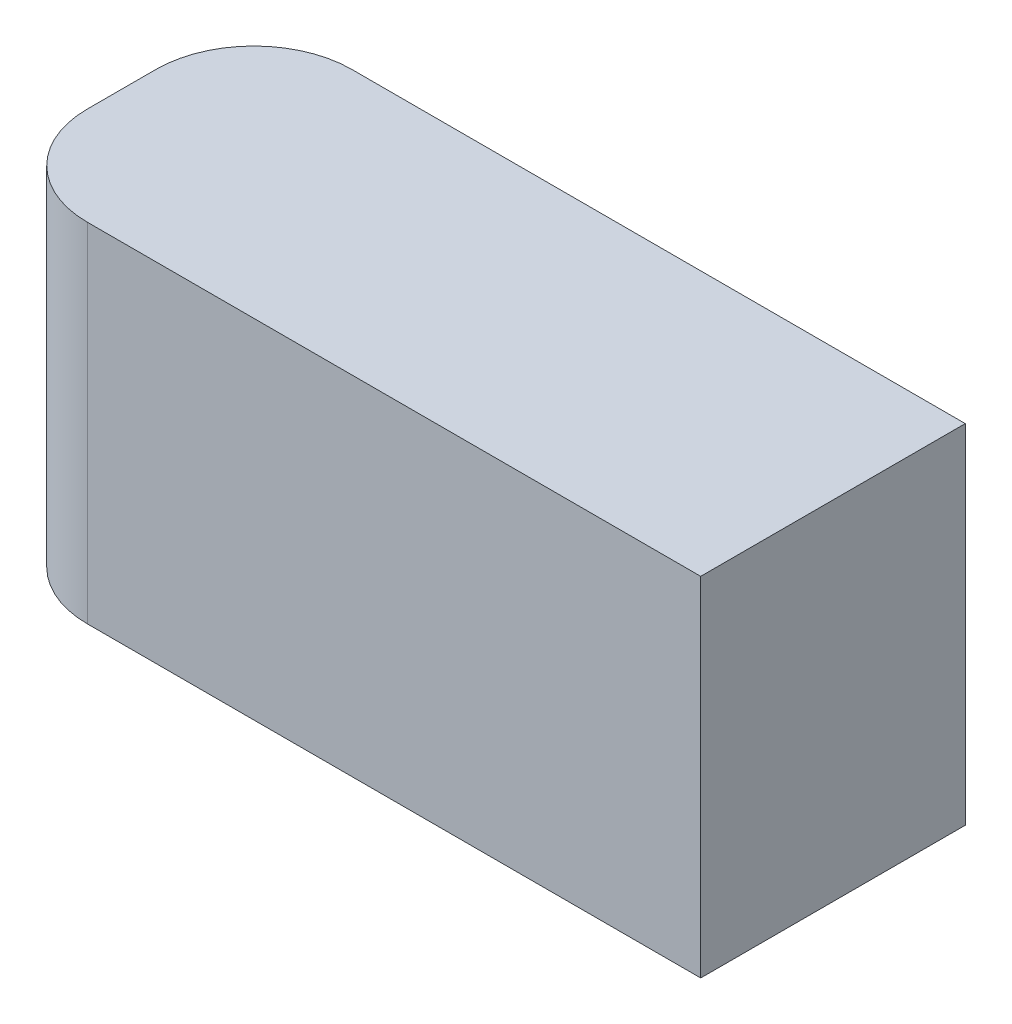
ISO-10303-21;
HEADER;
FILE_DESCRIPTION(('STEP AP214'),'2;1');
FILE_NAME('part.step','',(''),(''),'','','');
FILE_SCHEMA(('AUTOMOTIVE_DESIGN { 1 0 10303 214 1 1 1 1 }'));
ENDSEC;
DATA;
#1=APPLICATION_CONTEXT('core data for automotive mechanical design processes');
#2=APPLICATION_PROTOCOL_DEFINITION('international standard','automotive_design',2000,#1);
#3=PRODUCT_CONTEXT('',#1,'mechanical');
#4=PRODUCT('Part','Part','',(#3));
#5=PRODUCT_RELATED_PRODUCT_CATEGORY('part','',(#4));
#6=PRODUCT_DEFINITION_FORMATION('','',#4);
#7=PRODUCT_DEFINITION_CONTEXT('part definition',#1,'design');
#8=PRODUCT_DEFINITION('design','',#6,#7);
#9=PRODUCT_DEFINITION_SHAPE('','',#8);
#10=(LENGTH_UNIT() NAMED_UNIT(*) SI_UNIT(.MILLI.,.METRE.));
#11=(NAMED_UNIT(*) PLANE_ANGLE_UNIT() SI_UNIT($,.RADIAN.));
#12=(NAMED_UNIT(*) SI_UNIT($,.STERADIAN.) SOLID_ANGLE_UNIT());
#13=UNCERTAINTY_MEASURE_WITH_UNIT(LENGTH_MEASURE(1.E-05),#10,'distance_accuracy_value','');
#14=(GEOMETRIC_REPRESENTATION_CONTEXT(3) GLOBAL_UNCERTAINTY_ASSIGNED_CONTEXT((#13)) GLOBAL_UNIT_ASSIGNED_CONTEXT((#10,
#11,#12)) REPRESENTATION_CONTEXT('',''));
#15=CARTESIAN_POINT('',(0.,0.,0.));
#16=DIRECTION('',(0.,0.,1.));
#17=DIRECTION('',(1.,0.,0.));
#18=AXIS2_PLACEMENT_3D('',#15,#16,#17);
#19=CARTESIAN_POINT('',(36.3,-17.75,27.));
#20=DIRECTION('',(-1.,0.,0.));
#21=DIRECTION('',(0.,0.,1.));
#22=AXIS2_PLACEMENT_3D('',#19,#20,#21);
#23=PLANE('',#22);
#24=DIRECTION('',(0.,1.,0.));
#25=VECTOR('',#24,1.);
#26=CARTESIAN_POINT('',(36.3,-17.75,0.));
#27=LINE('',#26,#25);
#28=CARTESIAN_POINT('',(36.3,-17.75,0.));
#29=VERTEX_POINT('',#28);
#30=CARTESIAN_POINT('',(36.3,17.75,0.));
#31=VERTEX_POINT('',#30);
#32=EDGE_CURVE('E115',#29,#31,#27,.T.);
#33=ORIENTED_EDGE('',*,*,#32,.T.);
#34=DIRECTION('',(0.,0.,-1.));
#35=VECTOR('',#34,1.);
#36=CARTESIAN_POINT('',(36.3,17.75,27.));
#37=LINE('',#36,#35);
#38=CARTESIAN_POINT('',(36.3,17.75,27.));
#39=VERTEX_POINT('',#38);
#40=EDGE_CURVE('E97',#39,#31,#37,.T.);
#41=ORIENTED_EDGE('',*,*,#40,.F.);
#42=DIRECTION('',(0.,1.,0.));
#43=VECTOR('',#42,1.);
#44=CARTESIAN_POINT('',(36.3,-17.75,27.));
#45=LINE('',#44,#43);
#46=CARTESIAN_POINT('',(36.3,-17.75,27.));
#47=VERTEX_POINT('',#46);
#48=EDGE_CURVE('E103',#47,#39,#45,.T.);
#49=ORIENTED_EDGE('',*,*,#48,.F.);
#50=DIRECTION('',(0.,0.,-1.));
#51=VECTOR('',#50,1.);
#52=CARTESIAN_POINT('',(36.3,-17.75,27.));
#53=LINE('',#52,#51);
#54=EDGE_CURVE('E161',#47,#29,#53,.T.);
#55=ORIENTED_EDGE('',*,*,#54,.T.);
#56=EDGE_LOOP('',(#33,#41,#49,#55));
#57=FACE_BOUND('',#56,.T.);
#58=ADVANCED_FACE('F39',(#57),#23,.F.);
#59=CARTESIAN_POINT('',(-36.3,17.75,27.));
#60=DIRECTION('',(0.,-1.,0.));
#61=DIRECTION('',(0.,0.,-1.));
#62=AXIS2_PLACEMENT_3D('',#59,#60,#61);
#63=PLANE('',#62);
#64=DIRECTION('',(-1.,0.,0.));
#65=VECTOR('',#64,1.);
#66=CARTESIAN_POINT('',(-36.3,17.75,0.));
#67=LINE('',#66,#65);
#68=CARTESIAN_POINT('',(-26.3,17.75,0.));
#69=VERTEX_POINT('',#68);
#70=EDGE_CURVE('E143',#31,#69,#67,.T.);
#71=ORIENTED_EDGE('',*,*,#70,.T.);
#72=CARTESIAN_POINT('',(-26.3,17.75,10.));
#73=DIRECTION('',(0.,-1.,0.));
#74=DIRECTION('',(0.,0.,-1.));
#75=AXIS2_PLACEMENT_3D('',#72,#73,#74);
#76=CIRCLE('',#75,10.);
#77=CARTESIAN_POINT('',(-36.3,17.75,10.));
#78=VERTEX_POINT('',#77);
#79=EDGE_CURVE('E48',#69,#78,#76,.F.);
#80=ORIENTED_EDGE('',*,*,#79,.T.);
#81=DIRECTION('',(0.,0.,-1.));
#82=VECTOR('',#81,1.);
#83=CARTESIAN_POINT('',(-36.3,17.75,27.));
#84=LINE('',#83,#82);
#85=CARTESIAN_POINT('',(-36.3,17.75,17.));
#86=VERTEX_POINT('',#85);
#87=EDGE_CURVE('E118',#86,#78,#84,.T.);
#88=ORIENTED_EDGE('',*,*,#87,.F.);
#89=CARTESIAN_POINT('',(-26.3,17.75,17.));
#90=DIRECTION('',(0.,-1.,0.));
#91=DIRECTION('',(0.,0.,-1.));
#92=AXIS2_PLACEMENT_3D('',#89,#90,#91);
#93=CIRCLE('',#92,10.);
#94=CARTESIAN_POINT('',(-26.3,17.75,27.));
#95=VERTEX_POINT('',#94);
#96=EDGE_CURVE('E55',#86,#95,#93,.F.);
#97=ORIENTED_EDGE('',*,*,#96,.T.);
#98=DIRECTION('',(-1.,0.,0.));
#99=VECTOR('',#98,1.);
#100=CARTESIAN_POINT('',(-36.3,17.75,27.));
#101=LINE('',#100,#99);
#102=EDGE_CURVE('E93',#39,#95,#101,.T.);
#103=ORIENTED_EDGE('',*,*,#102,.F.);
#104=ORIENTED_EDGE('',*,*,#40,.T.);
#105=EDGE_LOOP('',(#71,#80,#88,#97,#103,#104));
#106=FACE_BOUND('',#105,.T.);
#107=ADVANCED_FACE('F95',(#106),#63,.F.);
#108=CARTESIAN_POINT('',(-36.3,-17.75,27.));
#109=DIRECTION('',(1.,0.,0.));
#110=DIRECTION('',(0.,0.,-1.));
#111=AXIS2_PLACEMENT_3D('',#108,#109,#110);
#112=PLANE('',#111);
#113=ORIENTED_EDGE('',*,*,#87,.T.);
#114=DIRECTION('',(0.,-1.,0.));
#115=VECTOR('',#114,1.);
#116=CARTESIAN_POINT('',(-36.3,-17.75,10.));
#117=LINE('',#116,#115);
#118=CARTESIAN_POINT('',(-36.3,-17.75,10.));
#119=VERTEX_POINT('',#118);
#120=EDGE_CURVE('E122',#78,#119,#117,.T.);
#121=ORIENTED_EDGE('',*,*,#120,.T.);
#122=DIRECTION('',(0.,0.,-1.));
#123=VECTOR('',#122,1.);
#124=CARTESIAN_POINT('',(-36.3,-17.75,27.));
#125=LINE('',#124,#123);
#126=CARTESIAN_POINT('',(-36.3,-17.75,17.));
#127=VERTEX_POINT('',#126);
#128=EDGE_CURVE('E125',#127,#119,#125,.T.);
#129=ORIENTED_EDGE('',*,*,#128,.F.);
#130=DIRECTION('',(0.,-1.,0.));
#131=VECTOR('',#130,1.);
#132=CARTESIAN_POINT('',(-36.3,-17.75,17.));
#133=LINE('',#132,#131);
#134=EDGE_CURVE('E117',#127,#86,#133,.F.);
#135=ORIENTED_EDGE('',*,*,#134,.T.);
#136=EDGE_LOOP('',(#113,#121,#129,#135));
#137=FACE_BOUND('',#136,.T.);
#138=ADVANCED_FACE('F147',(#137),#112,.F.);
#139=CARTESIAN_POINT('',(-36.3,-17.75,27.));
#140=DIRECTION('',(0.,1.,0.));
#141=DIRECTION('',(0.,0.,1.));
#142=AXIS2_PLACEMENT_3D('',#139,#140,#141);
#143=PLANE('',#142);
#144=ORIENTED_EDGE('',*,*,#128,.T.);
#145=CARTESIAN_POINT('',(-26.3,-17.75,10.));
#146=DIRECTION('',(0.,1.,0.));
#147=DIRECTION('',(0.,0.,1.));
#148=AXIS2_PLACEMENT_3D('',#145,#146,#147);
#149=CIRCLE('',#148,10.);
#150=CARTESIAN_POINT('',(-26.3,-17.75,0.));
#151=VERTEX_POINT('',#150);
#152=EDGE_CURVE('E135',#119,#151,#149,.F.);
#153=ORIENTED_EDGE('',*,*,#152,.T.);
#154=DIRECTION('',(1.,0.,0.));
#155=VECTOR('',#154,1.);
#156=CARTESIAN_POINT('',(-36.3,-17.75,0.));
#157=LINE('',#156,#155);
#158=EDGE_CURVE('E112',#151,#29,#157,.T.);
#159=ORIENTED_EDGE('',*,*,#158,.T.);
#160=ORIENTED_EDGE('',*,*,#54,.F.);
#161=DIRECTION('',(1.,0.,0.));
#162=VECTOR('',#161,1.);
#163=CARTESIAN_POINT('',(-36.3,-17.75,27.));
#164=LINE('',#163,#162);
#165=CARTESIAN_POINT('',(-26.3,-17.75,27.));
#166=VERTEX_POINT('',#165);
#167=EDGE_CURVE('E102',#166,#47,#164,.T.);
#168=ORIENTED_EDGE('',*,*,#167,.F.);
#169=CARTESIAN_POINT('',(-26.3,-17.75,17.));
#170=DIRECTION('',(0.,1.,0.));
#171=DIRECTION('',(0.,0.,1.));
#172=AXIS2_PLACEMENT_3D('',#169,#170,#171);
#173=CIRCLE('',#172,10.);
#174=EDGE_CURVE('E132',#166,#127,#173,.F.);
#175=ORIENTED_EDGE('',*,*,#174,.T.);
#176=EDGE_LOOP('',(#144,#153,#159,#160,#168,#175));
#177=FACE_BOUND('',#176,.T.);
#178=ADVANCED_FACE('F153',(#177),#143,.F.);
#179=CARTESIAN_POINT('',(0.,0.,27.));
#180=DIRECTION('',(0.,0.,-1.));
#181=DIRECTION('',(-1.,0.,0.));
#182=AXIS2_PLACEMENT_3D('',#179,#180,#181);
#183=PLANE('',#182);
#184=ORIENTED_EDGE('',*,*,#102,.T.);
#185=DIRECTION('',(0.,-1.,0.));
#186=VECTOR('',#185,1.);
#187=CARTESIAN_POINT('',(-26.3,0.,27.));
#188=LINE('',#187,#186);
#189=EDGE_CURVE('E11',#95,#166,#188,.T.);
#190=ORIENTED_EDGE('',*,*,#189,.T.);
#191=ORIENTED_EDGE('',*,*,#167,.T.);
#192=ORIENTED_EDGE('',*,*,#48,.T.);
#193=EDGE_LOOP('',(#184,#190,#191,#192));
#194=FACE_BOUND('',#193,.T.);
#195=ADVANCED_FACE('F106',(#194),#183,.F.);
#196=CARTESIAN_POINT('',(0.,0.,0.));
#197=DIRECTION('',(0.,0.,-1.));
#198=DIRECTION('',(-1.,0.,0.));
#199=AXIS2_PLACEMENT_3D('',#196,#197,#198);
#200=PLANE('',#199);
#201=ORIENTED_EDGE('',*,*,#158,.F.);
#202=DIRECTION('',(0.,-1.,0.));
#203=VECTOR('',#202,1.);
#204=CARTESIAN_POINT('',(-26.3,17.75,0.));
#205=LINE('',#204,#203);
#206=EDGE_CURVE('E63',#151,#69,#205,.F.);
#207=ORIENTED_EDGE('',*,*,#206,.T.);
#208=ORIENTED_EDGE('',*,*,#70,.F.);
#209=ORIENTED_EDGE('',*,*,#32,.F.);
#210=EDGE_LOOP('',(#201,#207,#208,#209));
#211=FACE_BOUND('',#210,.T.);
#212=ADVANCED_FACE('F154',(#211),#200,.T.);
#213=CARTESIAN_POINT('',(-26.3,-17.75,10.));
#214=DIRECTION('',(0.,1.,0.));
#215=DIRECTION('',(0.,0.,1.));
#216=AXIS2_PLACEMENT_3D('',#213,#214,#215);
#217=CYLINDRICAL_SURFACE('',#216,10.);
#218=ORIENTED_EDGE('',*,*,#79,.F.);
#219=ORIENTED_EDGE('',*,*,#206,.F.);
#220=ORIENTED_EDGE('',*,*,#152,.F.);
#221=ORIENTED_EDGE('',*,*,#120,.F.);
#222=EDGE_LOOP('',(#218,#219,#220,#221));
#223=FACE_BOUND('',#222,.T.);
#224=ADVANCED_FACE('F151',(#223),#217,.T.);
#225=CARTESIAN_POINT('',(-26.3,0.,17.));
#226=DIRECTION('',(0.,-1.,0.));
#227=DIRECTION('',(0.,0.,-1.));
#228=AXIS2_PLACEMENT_3D('',#225,#226,#227);
#229=CYLINDRICAL_SURFACE('',#228,10.);
#230=ORIENTED_EDGE('',*,*,#96,.F.);
#231=ORIENTED_EDGE('',*,*,#134,.F.);
#232=ORIENTED_EDGE('',*,*,#174,.F.);
#233=ORIENTED_EDGE('',*,*,#189,.F.);
#234=EDGE_LOOP('',(#230,#231,#232,#233));
#235=FACE_BOUND('',#234,.T.);
#236=ADVANCED_FACE('F41',(#235),#229,.T.);
#237=CLOSED_SHELL('',(#58,#107,#138,#178,#195,#212,#224,#236));
#238=MANIFOLD_SOLID_BREP('B2',#237);
#239=ADVANCED_BREP_SHAPE_REPRESENTATION('',(#18,#238),#14);
#240=SHAPE_DEFINITION_REPRESENTATION(#9,#239);
ENDSEC;
END-ISO-10303-21;
